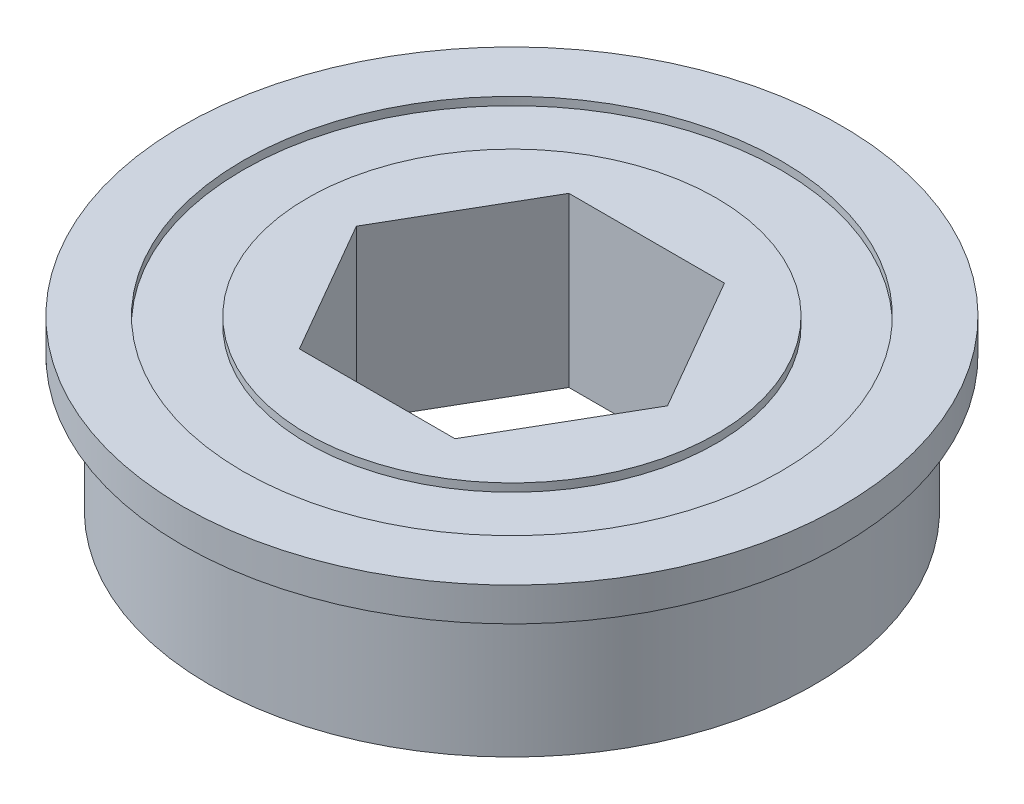
ISO-10303-21;
HEADER;
FILE_DESCRIPTION(('STEP AP214'),'2;1');
FILE_NAME('part.step','',(''),(''),'','','');
FILE_SCHEMA(('AUTOMOTIVE_DESIGN { 1 0 10303 214 1 1 1 1 }'));
ENDSEC;
DATA;
#1=APPLICATION_CONTEXT('core data for automotive mechanical design processes');
#2=APPLICATION_PROTOCOL_DEFINITION('international standard','automotive_design',2000,#1);
#3=PRODUCT_CONTEXT('',#1,'mechanical');
#4=PRODUCT('Part','Part','',(#3));
#5=PRODUCT_RELATED_PRODUCT_CATEGORY('part','',(#4));
#6=PRODUCT_DEFINITION_FORMATION('','',#4);
#7=PRODUCT_DEFINITION_CONTEXT('part definition',#1,'design');
#8=PRODUCT_DEFINITION('design','',#6,#7);
#9=PRODUCT_DEFINITION_SHAPE('','',#8);
#10=(LENGTH_UNIT() NAMED_UNIT(*) SI_UNIT(.MILLI.,.METRE.));
#11=(NAMED_UNIT(*) PLANE_ANGLE_UNIT() SI_UNIT($,.RADIAN.));
#12=(NAMED_UNIT(*) SI_UNIT($,.STERADIAN.) SOLID_ANGLE_UNIT());
#13=UNCERTAINTY_MEASURE_WITH_UNIT(LENGTH_MEASURE(1.E-05),#10,'distance_accuracy_value','');
#14=(GEOMETRIC_REPRESENTATION_CONTEXT(3) GLOBAL_UNCERTAINTY_ASSIGNED_CONTEXT((#13)) GLOBAL_UNIT_ASSIGNED_CONTEXT((#10,
#11,#12)) REPRESENTATION_CONTEXT('',''));
#15=CARTESIAN_POINT('',(0.,0.,0.));
#16=DIRECTION('',(0.,0.,1.));
#17=DIRECTION('',(1.,0.,0.));
#18=AXIS2_PLACEMENT_3D('',#15,#16,#17);
#19=CARTESIAN_POINT('',(0.,7.9375,0.));
#20=DIRECTION('',(0.,1.,0.));
#21=DIRECTION('',(0.,0.,1.));
#22=AXIS2_PLACEMENT_3D('',#19,#20,#21);
#23=PLANE('',#22);
#24=DIRECTION('',(-0.5,0.,-0.866025403784439));
#25=VECTOR('',#24,1.);
#26=CARTESIAN_POINT('',(-3.67194770049901,7.9375,6.35999998));
#27=LINE('',#26,#25);
#28=CARTESIAN_POINT('',(-3.67194770049901,7.9375,6.35999998));
#29=VERTEX_POINT('',#28);
#30=CARTESIAN_POINT('',(-7.34389540099803,7.9375,0.));
#31=VERTEX_POINT('',#30);
#32=EDGE_CURVE('E88',#29,#31,#27,.T.);
#33=ORIENTED_EDGE('',*,*,#32,.T.);
#34=DIRECTION('',(0.5,0.,-0.866025403784439));
#35=VECTOR('',#34,1.);
#36=CARTESIAN_POINT('',(-7.34389540099803,7.9375,0.));
#37=LINE('',#36,#35);
#38=CARTESIAN_POINT('',(-3.67194770049902,7.9375,-6.35999998));
#39=VERTEX_POINT('',#38);
#40=EDGE_CURVE('E97',#31,#39,#37,.T.);
#41=ORIENTED_EDGE('',*,*,#40,.T.);
#42=DIRECTION('',(1.,0.,0.));
#43=VECTOR('',#42,1.);
#44=CARTESIAN_POINT('',(-3.67194770049902,7.9375,-6.35999998));
#45=LINE('',#44,#43);
#46=CARTESIAN_POINT('',(3.67194770049901,7.9375,-6.35999998));
#47=VERTEX_POINT('',#46);
#48=EDGE_CURVE('E48',#39,#47,#45,.T.);
#49=ORIENTED_EDGE('',*,*,#48,.T.);
#50=DIRECTION('',(0.5,0.,0.866025403784439));
#51=VECTOR('',#50,1.);
#52=CARTESIAN_POINT('',(3.67194770049901,7.9375,-6.35999998));
#53=LINE('',#52,#51);
#54=CARTESIAN_POINT('',(7.34389540099803,7.9375,0.));
#55=VERTEX_POINT('',#54);
#56=EDGE_CURVE('E114',#47,#55,#53,.T.);
#57=ORIENTED_EDGE('',*,*,#56,.T.);
#58=DIRECTION('',(-0.5,0.,0.866025403784439));
#59=VECTOR('',#58,1.);
#60=CARTESIAN_POINT('',(7.34389540099803,7.9375,0.));
#61=LINE('',#60,#59);
#62=CARTESIAN_POINT('',(3.67194770049902,7.9375,6.35999998));
#63=VERTEX_POINT('',#62);
#64=EDGE_CURVE('E117',#55,#63,#61,.T.);
#65=ORIENTED_EDGE('',*,*,#64,.T.);
#66=DIRECTION('',(-1.,0.,0.));
#67=VECTOR('',#66,1.);
#68=CARTESIAN_POINT('',(3.67194770049902,7.9375,6.35999998));
#69=LINE('',#68,#67);
#70=EDGE_CURVE('E94',#63,#29,#69,.T.);
#71=ORIENTED_EDGE('',*,*,#70,.T.);
#72=EDGE_LOOP('',(#33,#41,#49,#57,#65,#71));
#73=FACE_BOUND('',#72,.T.);
#74=CARTESIAN_POINT('',(0.,7.9375,0.));
#75=DIRECTION('',(0.,1.,0.));
#76=DIRECTION('',(0.,0.,-1.));
#77=AXIS2_PLACEMENT_3D('',#74,#75,#76);
#78=CIRCLE('',#77,9.652);
#79=CARTESIAN_POINT('',(0.,7.9375,-9.652));
#80=VERTEX_POINT('',#79);
#81=EDGE_CURVE('E208',#80,#80,#78,.T.);
#82=ORIENTED_EDGE('',*,*,#81,.T.);
#83=EDGE_LOOP('',(#82));
#84=FACE_BOUND('',#83,.T.);
#85=ADVANCED_FACE('F33',(#73,#84),#23,.T.);
#86=CARTESIAN_POINT('',(0.,0.,0.));
#87=DIRECTION('',(0.,1.,0.));
#88=DIRECTION('',(0.,0.,1.));
#89=AXIS2_PLACEMENT_3D('',#86,#87,#88);
#90=CYLINDRICAL_SURFACE('',#89,14.2748);
#91=CARTESIAN_POINT('',(0.,0.,0.));
#92=DIRECTION('',(0.,1.,0.));
#93=DIRECTION('',(0.,0.,1.));
#94=AXIS2_PLACEMENT_3D('',#91,#92,#93);
#95=CIRCLE('',#94,14.2748);
#96=CARTESIAN_POINT('',(0.,0.,14.2748));
#97=VERTEX_POINT('',#96);
#98=EDGE_CURVE('E151',#97,#97,#95,.T.);
#99=ORIENTED_EDGE('',*,*,#98,.T.);
#100=EDGE_LOOP('',(#99));
#101=FACE_BOUND('',#100,.T.);
#102=CARTESIAN_POINT('',(0.,5.6,0.));
#103=DIRECTION('',(0.,1.,0.));
#104=DIRECTION('',(0.,0.,1.));
#105=AXIS2_PLACEMENT_3D('',#102,#103,#104);
#106=CIRCLE('',#105,14.2748);
#107=CARTESIAN_POINT('',(0.,5.6,14.2748));
#108=VERTEX_POINT('',#107);
#109=EDGE_CURVE('E11',#108,#108,#106,.T.);
#110=ORIENTED_EDGE('',*,*,#109,.F.);
#111=EDGE_LOOP('',(#110));
#112=FACE_BOUND('',#111,.T.);
#113=ADVANCED_FACE('F35',(#101,#112),#90,.T.);
#114=CARTESIAN_POINT('',(0.,5.975,0.));
#115=DIRECTION('',(0.,-1.,0.));
#116=DIRECTION('',(0.,0.,-1.));
#117=AXIS2_PLACEMENT_3D('',#114,#115,#116);
#118=CONICAL_SURFACE('',#117,14.0582936490539,0.523598775598299);
#119=ORIENTED_EDGE('',*,*,#109,.T.);
#120=EDGE_LOOP('',(#119));
#121=FACE_BOUND('',#120,.T.);
#122=CARTESIAN_POINT('',(0.,5.975,0.));
#123=DIRECTION('',(0.,1.,0.));
#124=DIRECTION('',(0.,0.,1.));
#125=AXIS2_PLACEMENT_3D('',#122,#123,#124);
#126=CIRCLE('',#125,14.0582936490539);
#127=CARTESIAN_POINT('',(0.,5.975,14.0582936490539));
#128=VERTEX_POINT('',#127);
#129=EDGE_CURVE('E41',#128,#128,#126,.T.);
#130=ORIENTED_EDGE('',*,*,#129,.F.);
#131=EDGE_LOOP('',(#130));
#132=FACE_BOUND('',#131,.T.);
#133=ADVANCED_FACE('F170',(#121,#132),#118,.T.);
#134=CARTESIAN_POINT('',(0.,6.1,0.));
#135=DIRECTION('',(0.,1.,0.));
#136=DIRECTION('',(0.,0.,1.));
#137=AXIS2_PLACEMENT_3D('',#134,#135,#136);
#138=TOROIDAL_SURFACE('',#137,14.2748,0.249999999999998);
#139=ORIENTED_EDGE('',*,*,#129,.T.);
#140=EDGE_LOOP('',(#139));
#141=FACE_BOUND('',#140,.T.);
#142=CARTESIAN_POINT('',(0.,6.35,0.));
#143=DIRECTION('',(0.,1.,0.));
#144=DIRECTION('',(0.,0.,1.));
#145=AXIS2_PLACEMENT_3D('',#142,#143,#144);
#146=CIRCLE('',#145,14.2748);
#147=CARTESIAN_POINT('',(0.,6.35,14.2748));
#148=VERTEX_POINT('',#147);
#149=EDGE_CURVE('E162',#148,#148,#146,.T.);
#150=ORIENTED_EDGE('',*,*,#149,.F.);
#151=EDGE_LOOP('',(#150));
#152=FACE_BOUND('',#151,.T.);
#153=ADVANCED_FACE('F167',(#141,#152),#138,.F.);
#154=CARTESIAN_POINT('',(-15.5575,6.35,0.));
#155=DIRECTION('',(0.,-1.,0.));
#156=DIRECTION('',(0.,0.,-1.));
#157=AXIS2_PLACEMENT_3D('',#154,#155,#156);
#158=PLANE('',#157);
#159=ORIENTED_EDGE('',*,*,#149,.T.);
#160=EDGE_LOOP('',(#159));
#161=FACE_BOUND('',#160,.T.);
#162=CARTESIAN_POINT('',(0.,6.35,0.));
#163=DIRECTION('',(0.,1.,0.));
#164=DIRECTION('',(0.,0.,1.));
#165=AXIS2_PLACEMENT_3D('',#162,#163,#164);
#166=CIRCLE('',#165,15.5575);
#167=CARTESIAN_POINT('',(0.,6.35,15.5575));
#168=VERTEX_POINT('',#167);
#169=EDGE_CURVE('E159',#168,#168,#166,.T.);
#170=ORIENTED_EDGE('',*,*,#169,.F.);
#171=EDGE_LOOP('',(#170));
#172=FACE_BOUND('',#171,.T.);
#173=ADVANCED_FACE('F177',(#161,#172),#158,.T.);
#174=CARTESIAN_POINT('',(0.,0.,0.));
#175=DIRECTION('',(0.,1.,0.));
#176=DIRECTION('',(0.,0.,1.));
#177=AXIS2_PLACEMENT_3D('',#174,#175,#176);
#178=CYLINDRICAL_SURFACE('',#177,15.5575);
#179=ORIENTED_EDGE('',*,*,#169,.T.);
#180=EDGE_LOOP('',(#179));
#181=FACE_BOUND('',#180,.T.);
#182=CARTESIAN_POINT('',(0.,7.9375,0.));
#183=DIRECTION('',(0.,1.,0.));
#184=DIRECTION('',(0.,0.,1.));
#185=AXIS2_PLACEMENT_3D('',#182,#183,#184);
#186=CIRCLE('',#185,15.5575);
#187=CARTESIAN_POINT('',(0.,7.9375,15.5575));
#188=VERTEX_POINT('',#187);
#189=EDGE_CURVE('E156',#188,#188,#186,.T.);
#190=ORIENTED_EDGE('',*,*,#189,.F.);
#191=EDGE_LOOP('',(#190));
#192=FACE_BOUND('',#191,.T.);
#193=ADVANCED_FACE('F189',(#181,#192),#178,.T.);
#194=CARTESIAN_POINT('',(0.,7.9375,0.));
#195=DIRECTION('',(0.,1.,0.));
#196=DIRECTION('',(0.,0.,-1.));
#197=AXIS2_PLACEMENT_3D('',#194,#195,#196);
#198=CIRCLE('',#197,12.7);
#199=CARTESIAN_POINT('',(0.,7.9375,-12.7));
#200=VERTEX_POINT('',#199);
#201=EDGE_CURVE('E110',#200,#200,#198,.T.);
#202=ORIENTED_EDGE('',*,*,#201,.F.);
#203=EDGE_LOOP('',(#202));
#204=FACE_BOUND('',#203,.T.);
#205=ORIENTED_EDGE('',*,*,#189,.T.);
#206=EDGE_LOOP('',(#205));
#207=FACE_BOUND('',#206,.T.);
#208=ADVANCED_FACE('F182',(#204,#207),#23,.T.);
#209=CARTESIAN_POINT('',(-14.2748,0.,0.));
#210=DIRECTION('',(0.,-1.,0.));
#211=DIRECTION('',(0.,0.,-1.));
#212=AXIS2_PLACEMENT_3D('',#209,#210,#211);
#213=PLANE('',#212);
#214=CARTESIAN_POINT('',(0.,0.,0.));
#215=DIRECTION('',(0.,-1.,0.));
#216=DIRECTION('',(0.,0.,1.));
#217=AXIS2_PLACEMENT_3D('',#214,#215,#216);
#218=CIRCLE('',#217,12.7);
#219=CARTESIAN_POINT('',(0.,0.,12.7));
#220=VERTEX_POINT('',#219);
#221=EDGE_CURVE('E145',#220,#220,#218,.T.);
#222=ORIENTED_EDGE('',*,*,#221,.F.);
#223=EDGE_LOOP('',(#222));
#224=FACE_BOUND('',#223,.T.);
#225=ORIENTED_EDGE('',*,*,#98,.F.);
#226=EDGE_LOOP('',(#225));
#227=FACE_BOUND('',#226,.T.);
#228=ADVANCED_FACE('F188',(#224,#227),#213,.T.);
#229=CARTESIAN_POINT('',(0.,0.381,0.));
#230=DIRECTION('',(0.,-1.,0.));
#231=DIRECTION('',(0.,0.,-1.));
#232=AXIS2_PLACEMENT_3D('',#229,#230,#231);
#233=CYLINDRICAL_SURFACE('',#232,12.7);
#234=CARTESIAN_POINT('',(0.,0.381,0.));
#235=DIRECTION('',(0.,-1.,0.));
#236=DIRECTION('',(0.,0.,1.));
#237=AXIS2_PLACEMENT_3D('',#234,#235,#236);
#238=CIRCLE('',#237,12.7);
#239=CARTESIAN_POINT('',(0.,0.381,12.7));
#240=VERTEX_POINT('',#239);
#241=EDGE_CURVE('E148',#240,#240,#238,.T.);
#242=ORIENTED_EDGE('',*,*,#241,.F.);
#243=EDGE_LOOP('',(#242));
#244=FACE_BOUND('',#243,.T.);
#245=ORIENTED_EDGE('',*,*,#221,.T.);
#246=EDGE_LOOP('',(#245));
#247=FACE_BOUND('',#246,.T.);
#248=ADVANCED_FACE('F195',(#244,#247),#233,.F.);
#249=CARTESIAN_POINT('',(0.,0.381,0.));
#250=DIRECTION('',(0.,1.,0.));
#251=DIRECTION('',(0.,0.,1.));
#252=AXIS2_PLACEMENT_3D('',#249,#250,#251);
#253=PLANE('',#252);
#254=CARTESIAN_POINT('',(0.,0.381,0.));
#255=DIRECTION('',(0.,-1.,0.));
#256=DIRECTION('',(0.,0.,1.));
#257=AXIS2_PLACEMENT_3D('',#254,#255,#256);
#258=CIRCLE('',#257,9.652);
#259=CARTESIAN_POINT('',(0.,0.381,9.652));
#260=VERTEX_POINT('',#259);
#261=EDGE_CURVE('E142',#260,#260,#258,.T.);
#262=ORIENTED_EDGE('',*,*,#261,.F.);
#263=EDGE_LOOP('',(#262));
#264=FACE_BOUND('',#263,.T.);
#265=ORIENTED_EDGE('',*,*,#241,.T.);
#266=EDGE_LOOP('',(#265));
#267=FACE_BOUND('',#266,.T.);
#268=ADVANCED_FACE('F252',(#264,#267),#253,.F.);
#269=CARTESIAN_POINT('',(0.,0.381,0.));
#270=DIRECTION('',(0.,-1.,0.));
#271=DIRECTION('',(0.,0.,-1.));
#272=AXIS2_PLACEMENT_3D('',#269,#270,#271);
#273=CYLINDRICAL_SURFACE('',#272,9.652);
#274=ORIENTED_EDGE('',*,*,#261,.T.);
#275=EDGE_LOOP('',(#274));
#276=FACE_BOUND('',#275,.T.);
#277=CARTESIAN_POINT('',(0.,0.,0.));
#278=DIRECTION('',(0.,-1.,0.));
#279=DIRECTION('',(0.,0.,1.));
#280=AXIS2_PLACEMENT_3D('',#277,#278,#279);
#281=CIRCLE('',#280,9.652);
#282=CARTESIAN_POINT('',(0.,0.,9.652));
#283=VERTEX_POINT('',#282);
#284=EDGE_CURVE('E134',#283,#283,#281,.T.);
#285=ORIENTED_EDGE('',*,*,#284,.F.);
#286=EDGE_LOOP('',(#285));
#287=FACE_BOUND('',#286,.T.);
#288=ADVANCED_FACE('F249',(#276,#287),#273,.T.);
#289=DIRECTION('',(-0.5,0.,-0.866025403784439));
#290=VECTOR('',#289,1.);
#291=CARTESIAN_POINT('',(-3.67194770049901,0.,6.35999998));
#292=LINE('',#291,#290);
#293=CARTESIAN_POINT('',(-3.67194770049901,0.,6.35999998));
#294=VERTEX_POINT('',#293);
#295=CARTESIAN_POINT('',(-7.34389540099803,0.,0.));
#296=VERTEX_POINT('',#295);
#297=EDGE_CURVE('E56',#294,#296,#292,.T.);
#298=ORIENTED_EDGE('',*,*,#297,.F.);
#299=DIRECTION('',(-1.,0.,0.));
#300=VECTOR('',#299,1.);
#301=CARTESIAN_POINT('',(3.67194770049902,0.,6.35999998));
#302=LINE('',#301,#300);
#303=CARTESIAN_POINT('',(3.67194770049902,0.,6.35999998));
#304=VERTEX_POINT('',#303);
#305=EDGE_CURVE('E104',#304,#294,#302,.T.);
#306=ORIENTED_EDGE('',*,*,#305,.F.);
#307=DIRECTION('',(-0.5,0.,0.866025403784439));
#308=VECTOR('',#307,1.);
#309=CARTESIAN_POINT('',(7.34389540099803,0.,0.));
#310=LINE('',#309,#308);
#311=CARTESIAN_POINT('',(7.34389540099803,0.,0.));
#312=VERTEX_POINT('',#311);
#313=EDGE_CURVE('E107',#312,#304,#310,.T.);
#314=ORIENTED_EDGE('',*,*,#313,.F.);
#315=DIRECTION('',(0.5,0.,0.866025403784439));
#316=VECTOR('',#315,1.);
#317=CARTESIAN_POINT('',(3.67194770049901,0.,-6.35999998));
#318=LINE('',#317,#316);
#319=CARTESIAN_POINT('',(3.67194770049901,0.,-6.35999998));
#320=VERTEX_POINT('',#319);
#321=EDGE_CURVE('E127',#320,#312,#318,.T.);
#322=ORIENTED_EDGE('',*,*,#321,.F.);
#323=DIRECTION('',(1.,0.,0.));
#324=VECTOR('',#323,1.);
#325=CARTESIAN_POINT('',(-3.67194770049902,0.,-6.35999998));
#326=LINE('',#325,#324);
#327=CARTESIAN_POINT('',(-3.67194770049902,0.,-6.35999998));
#328=VERTEX_POINT('',#327);
#329=EDGE_CURVE('E124',#328,#320,#326,.T.);
#330=ORIENTED_EDGE('',*,*,#329,.F.);
#331=DIRECTION('',(0.5,0.,-0.866025403784439));
#332=VECTOR('',#331,1.);
#333=CARTESIAN_POINT('',(-7.34389540099803,0.,0.));
#334=LINE('',#333,#332);
#335=EDGE_CURVE('E121',#296,#328,#334,.T.);
#336=ORIENTED_EDGE('',*,*,#335,.F.);
#337=EDGE_LOOP('',(#298,#306,#314,#322,#330,#336));
#338=FACE_BOUND('',#337,.T.);
#339=ORIENTED_EDGE('',*,*,#284,.T.);
#340=EDGE_LOOP('',(#339));
#341=FACE_BOUND('',#340,.T.);
#342=ADVANCED_FACE('F197',(#338,#341),#213,.T.);
#343=CARTESIAN_POINT('',(-3.67194770049901,7.9375,6.35999998));
#344=DIRECTION('',(-0.866025403784439,0.,0.5));
#345=DIRECTION('',(0.5,0.,0.866025403784439));
#346=AXIS2_PLACEMENT_3D('',#343,#344,#345);
#347=PLANE('',#346);
#348=ORIENTED_EDGE('',*,*,#297,.T.);
#349=DIRECTION('',(0.,-1.,0.));
#350=VECTOR('',#349,1.);
#351=CARTESIAN_POINT('',(-7.34389540099803,7.9375,0.));
#352=LINE('',#351,#350);
#353=EDGE_CURVE('E84',#31,#296,#352,.T.);
#354=ORIENTED_EDGE('',*,*,#353,.F.);
#355=ORIENTED_EDGE('',*,*,#32,.F.);
#356=DIRECTION('',(0.,-1.,0.));
#357=VECTOR('',#356,1.);
#358=CARTESIAN_POINT('',(-3.67194770049901,7.9375,6.35999998));
#359=LINE('',#358,#357);
#360=EDGE_CURVE('E132',#29,#294,#359,.T.);
#361=ORIENTED_EDGE('',*,*,#360,.T.);
#362=EDGE_LOOP('',(#348,#354,#355,#361));
#363=FACE_BOUND('',#362,.T.);
#364=ADVANCED_FACE('F86',(#363),#347,.F.);
#365=CARTESIAN_POINT('',(3.67194770049902,7.9375,6.35999998));
#366=DIRECTION('',(0.,0.,1.));
#367=DIRECTION('',(1.,0.,0.));
#368=AXIS2_PLACEMENT_3D('',#365,#366,#367);
#369=PLANE('',#368);
#370=ORIENTED_EDGE('',*,*,#305,.T.);
#371=ORIENTED_EDGE('',*,*,#360,.F.);
#372=ORIENTED_EDGE('',*,*,#70,.F.);
#373=DIRECTION('',(0.,-1.,0.));
#374=VECTOR('',#373,1.);
#375=CARTESIAN_POINT('',(3.67194770049902,7.9375,6.35999998));
#376=LINE('',#375,#374);
#377=EDGE_CURVE('E135',#63,#304,#376,.T.);
#378=ORIENTED_EDGE('',*,*,#377,.T.);
#379=EDGE_LOOP('',(#370,#371,#372,#378));
#380=FACE_BOUND('',#379,.T.);
#381=ADVANCED_FACE('F230',(#380),#369,.F.);
#382=CARTESIAN_POINT('',(7.34389540099803,7.9375,0.));
#383=DIRECTION('',(0.866025403784439,0.,0.5));
#384=DIRECTION('',(0.5,0.,-0.866025403784439));
#385=AXIS2_PLACEMENT_3D('',#382,#383,#384);
#386=PLANE('',#385);
#387=ORIENTED_EDGE('',*,*,#313,.T.);
#388=ORIENTED_EDGE('',*,*,#377,.F.);
#389=ORIENTED_EDGE('',*,*,#64,.F.);
#390=DIRECTION('',(0.,-1.,0.));
#391=VECTOR('',#390,1.);
#392=CARTESIAN_POINT('',(7.34389540099803,7.9375,0.));
#393=LINE('',#392,#391);
#394=EDGE_CURVE('E137',#55,#312,#393,.T.);
#395=ORIENTED_EDGE('',*,*,#394,.T.);
#396=EDGE_LOOP('',(#387,#388,#389,#395));
#397=FACE_BOUND('',#396,.T.);
#398=ADVANCED_FACE('F233',(#397),#386,.F.);
#399=CARTESIAN_POINT('',(3.67194770049901,7.9375,-6.35999998));
#400=DIRECTION('',(0.866025403784439,0.,-0.5));
#401=DIRECTION('',(-0.5,0.,-0.866025403784439));
#402=AXIS2_PLACEMENT_3D('',#399,#400,#401);
#403=PLANE('',#402);
#404=ORIENTED_EDGE('',*,*,#321,.T.);
#405=ORIENTED_EDGE('',*,*,#394,.F.);
#406=ORIENTED_EDGE('',*,*,#56,.F.);
#407=DIRECTION('',(0.,-1.,0.));
#408=VECTOR('',#407,1.);
#409=CARTESIAN_POINT('',(3.67194770049901,7.9375,-6.35999998));
#410=LINE('',#409,#408);
#411=EDGE_CURVE('E139',#47,#320,#410,.T.);
#412=ORIENTED_EDGE('',*,*,#411,.T.);
#413=EDGE_LOOP('',(#404,#405,#406,#412));
#414=FACE_BOUND('',#413,.T.);
#415=ADVANCED_FACE('F237',(#414),#403,.F.);
#416=CARTESIAN_POINT('',(-3.67194770049902,7.9375,-6.35999998));
#417=DIRECTION('',(0.,0.,-1.));
#418=DIRECTION('',(-1.,0.,0.));
#419=AXIS2_PLACEMENT_3D('',#416,#417,#418);
#420=PLANE('',#419);
#421=ORIENTED_EDGE('',*,*,#329,.T.);
#422=ORIENTED_EDGE('',*,*,#411,.F.);
#423=ORIENTED_EDGE('',*,*,#48,.F.);
#424=DIRECTION('',(0.,-1.,0.));
#425=VECTOR('',#424,1.);
#426=CARTESIAN_POINT('',(-3.67194770049902,7.9375,-6.35999998));
#427=LINE('',#426,#425);
#428=EDGE_CURVE('E93',#39,#328,#427,.T.);
#429=ORIENTED_EDGE('',*,*,#428,.T.);
#430=EDGE_LOOP('',(#421,#422,#423,#429));
#431=FACE_BOUND('',#430,.T.);
#432=ADVANCED_FACE('F241',(#431),#420,.F.);
#433=CARTESIAN_POINT('',(-7.34389540099803,7.9375,0.));
#434=DIRECTION('',(-0.866025403784439,0.,-0.5));
#435=DIRECTION('',(-0.5,0.,0.866025403784439));
#436=AXIS2_PLACEMENT_3D('',#433,#434,#435);
#437=PLANE('',#436);
#438=ORIENTED_EDGE('',*,*,#335,.T.);
#439=ORIENTED_EDGE('',*,*,#428,.F.);
#440=ORIENTED_EDGE('',*,*,#40,.F.);
#441=ORIENTED_EDGE('',*,*,#353,.T.);
#442=EDGE_LOOP('',(#438,#439,#440,#441));
#443=FACE_BOUND('',#442,.T.);
#444=ADVANCED_FACE('F98',(#443),#437,.F.);
#445=CARTESIAN_POINT('',(0.,7.5565,0.));
#446=DIRECTION('',(0.,1.,0.));
#447=DIRECTION('',(0.,0.,1.));
#448=AXIS2_PLACEMENT_3D('',#445,#446,#447);
#449=CYLINDRICAL_SURFACE('',#448,12.7);
#450=CARTESIAN_POINT('',(0.,7.5565,0.));
#451=DIRECTION('',(0.,1.,0.));
#452=DIRECTION('',(0.,0.,-1.));
#453=AXIS2_PLACEMENT_3D('',#450,#451,#452);
#454=CIRCLE('',#453,12.7);
#455=CARTESIAN_POINT('',(0.,7.5565,-12.7));
#456=VERTEX_POINT('',#455);
#457=EDGE_CURVE('E122',#456,#456,#454,.T.);
#458=ORIENTED_EDGE('',*,*,#457,.F.);
#459=EDGE_LOOP('',(#458));
#460=FACE_BOUND('',#459,.T.);
#461=ORIENTED_EDGE('',*,*,#201,.T.);
#462=EDGE_LOOP('',(#461));
#463=FACE_BOUND('',#462,.T.);
#464=ADVANCED_FACE('F223',(#460,#463),#449,.F.);
#465=CARTESIAN_POINT('',(0.,7.5565,0.));
#466=DIRECTION('',(0.,-1.,0.));
#467=DIRECTION('',(0.,0.,-1.));
#468=AXIS2_PLACEMENT_3D('',#465,#466,#467);
#469=PLANE('',#468);
#470=CARTESIAN_POINT('',(0.,7.5565,0.));
#471=DIRECTION('',(0.,1.,0.));
#472=DIRECTION('',(0.,0.,-1.));
#473=AXIS2_PLACEMENT_3D('',#470,#471,#472);
#474=CIRCLE('',#473,9.652);
#475=CARTESIAN_POINT('',(0.,7.5565,-9.652));
#476=VERTEX_POINT('',#475);
#477=EDGE_CURVE('E205',#476,#476,#474,.T.);
#478=ORIENTED_EDGE('',*,*,#477,.F.);
#479=EDGE_LOOP('',(#478));
#480=FACE_BOUND('',#479,.T.);
#481=ORIENTED_EDGE('',*,*,#457,.T.);
#482=EDGE_LOOP('',(#481));
#483=FACE_BOUND('',#482,.T.);
#484=ADVANCED_FACE('F218',(#480,#483),#469,.F.);
#485=CARTESIAN_POINT('',(0.,7.5565,0.));
#486=DIRECTION('',(0.,1.,0.));
#487=DIRECTION('',(0.,0.,1.));
#488=AXIS2_PLACEMENT_3D('',#485,#486,#487);
#489=CYLINDRICAL_SURFACE('',#488,9.652);
#490=ORIENTED_EDGE('',*,*,#477,.T.);
#491=EDGE_LOOP('',(#490));
#492=FACE_BOUND('',#491,.T.);
#493=ORIENTED_EDGE('',*,*,#81,.F.);
#494=EDGE_LOOP('',(#493));
#495=FACE_BOUND('',#494,.T.);
#496=ADVANCED_FACE('F216',(#492,#495),#489,.T.);
#497=CLOSED_SHELL('',(#85,#113,#133,#153,#173,#193,#208,#228,#248,#268,#288,#342,#364,#381,#398,
#415,#432,#444,#464,#484,#496));
#498=MANIFOLD_SOLID_BREP('B2',#497);
#499=ADVANCED_BREP_SHAPE_REPRESENTATION('',(#18,#498),#14);
#500=SHAPE_DEFINITION_REPRESENTATION(#9,#499);
ENDSEC;
END-ISO-10303-21;
